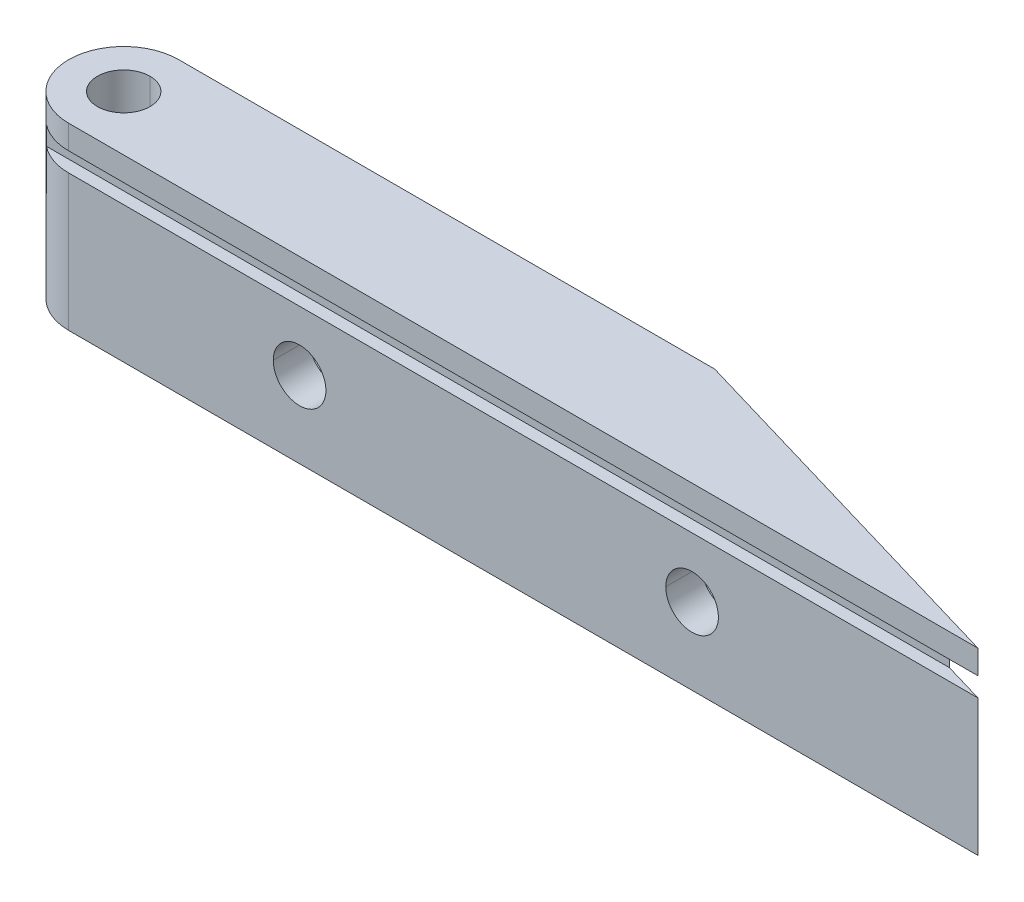
ISO-10303-21;
HEADER;
FILE_DESCRIPTION(('STEP AP214'),'2;1');
FILE_NAME('part.step','',(''),(''),'','','');
FILE_SCHEMA(('AUTOMOTIVE_DESIGN { 1 0 10303 214 1 1 1 1 }'));
ENDSEC;
DATA;
#1=APPLICATION_CONTEXT('core data for automotive mechanical design processes');
#2=APPLICATION_PROTOCOL_DEFINITION('international standard','automotive_design',2000,#1);
#3=PRODUCT_CONTEXT('',#1,'mechanical');
#4=PRODUCT('Part','Part','',(#3));
#5=PRODUCT_RELATED_PRODUCT_CATEGORY('part','',(#4));
#6=PRODUCT_DEFINITION_FORMATION('','',#4);
#7=PRODUCT_DEFINITION_CONTEXT('part definition',#1,'design');
#8=PRODUCT_DEFINITION('design','',#6,#7);
#9=PRODUCT_DEFINITION_SHAPE('','',#8);
#10=(LENGTH_UNIT() NAMED_UNIT(*) SI_UNIT(.MILLI.,.METRE.));
#11=(NAMED_UNIT(*) PLANE_ANGLE_UNIT() SI_UNIT($,.RADIAN.));
#12=(NAMED_UNIT(*) SI_UNIT($,.STERADIAN.) SOLID_ANGLE_UNIT());
#13=UNCERTAINTY_MEASURE_WITH_UNIT(LENGTH_MEASURE(1.E-05),#10,'distance_accuracy_value','');
#14=(GEOMETRIC_REPRESENTATION_CONTEXT(3) GLOBAL_UNCERTAINTY_ASSIGNED_CONTEXT((#13)) GLOBAL_UNIT_ASSIGNED_CONTEXT((#10,
#11,#12)) REPRESENTATION_CONTEXT('',''));
#15=CARTESIAN_POINT('',(0.,0.,0.));
#16=DIRECTION('',(0.,0.,1.));
#17=DIRECTION('',(1.,0.,0.));
#18=AXIS2_PLACEMENT_3D('',#15,#16,#17);
#19=CARTESIAN_POINT('',(-6.23,3.2,-2.8));
#20=DIRECTION('',(0.,0.,1.));
#21=DIRECTION('',(1.,0.,0.));
#22=AXIS2_PLACEMENT_3D('',#19,#20,#21);
#23=CYLINDRICAL_SURFACE('',#22,1.1);
#24=DIRECTION('',(0.,0.,1.));
#25=VECTOR('',#24,1.);
#26=CARTESIAN_POINT('',(-7.33,3.2,-2.8));
#27=LINE('',#26,#25);
#28=CARTESIAN_POINT('',(-7.33,3.2,0.3));
#29=VERTEX_POINT('',#28);
#30=CARTESIAN_POINT('',(-7.33,3.2,1.8));
#31=VERTEX_POINT('',#30);
#32=EDGE_CURVE('E220',#29,#31,#27,.T.);
#33=ORIENTED_EDGE('',*,*,#32,.F.);
#34=CARTESIAN_POINT('',(-6.23,3.2,0.3));
#35=DIRECTION('',(0.,0.,-1.));
#36=DIRECTION('',(-1.,0.,0.));
#37=AXIS2_PLACEMENT_3D('',#34,#35,#36);
#38=CIRCLE('',#37,1.1);
#39=CARTESIAN_POINT('',(-5.12999999999994,3.2,0.3));
#40=VERTEX_POINT('',#39);
#41=EDGE_CURVE('E215',#29,#40,#38,.T.);
#42=ORIENTED_EDGE('',*,*,#41,.T.);
#43=DIRECTION('',(0.,0.,1.));
#44=VECTOR('',#43,1.);
#45=CARTESIAN_POINT('',(-5.12999999999994,3.2,-2.8));
#46=LINE('',#45,#44);
#47=CARTESIAN_POINT('',(-5.12999999999994,3.2,1.8));
#48=VERTEX_POINT('',#47);
#49=EDGE_CURVE('E217',#40,#48,#46,.T.);
#50=ORIENTED_EDGE('',*,*,#49,.T.);
#51=CARTESIAN_POINT('',(-6.23,3.2,1.8));
#52=DIRECTION('',(0.,0.,1.));
#53=DIRECTION('',(1.,0.,0.));
#54=AXIS2_PLACEMENT_3D('',#51,#52,#53);
#55=CIRCLE('',#54,1.1);
#56=EDGE_CURVE('E345',#48,#31,#55,.T.);
#57=ORIENTED_EDGE('',*,*,#56,.T.);
#58=EDGE_LOOP('',(#33,#42,#50,#57));
#59=FACE_BOUND('',#58,.T.);
#60=ADVANCED_FACE('F15',(#59),#23,.F.);
#61=CARTESIAN_POINT('',(10.1714,3.2,-2.8));
#62=DIRECTION('',(0.,0.,1.));
#63=DIRECTION('',(1.,0.,0.));
#64=AXIS2_PLACEMENT_3D('',#61,#62,#63);
#65=CYLINDRICAL_SURFACE('',#64,1.1);
#66=DIRECTION('',(0.,0.,1.));
#67=VECTOR('',#66,1.);
#68=CARTESIAN_POINT('',(9.0714,3.2,-2.8));
#69=LINE('',#68,#67);
#70=CARTESIAN_POINT('',(9.0714,3.2,0.3));
#71=VERTEX_POINT('',#70);
#72=CARTESIAN_POINT('',(9.0714,3.2,1.8));
#73=VERTEX_POINT('',#72);
#74=EDGE_CURVE('E284',#71,#73,#69,.T.);
#75=ORIENTED_EDGE('',*,*,#74,.F.);
#76=CARTESIAN_POINT('',(10.1714,3.2,0.3));
#77=DIRECTION('',(0.,0.,-1.));
#78=DIRECTION('',(-1.,0.,0.));
#79=AXIS2_PLACEMENT_3D('',#76,#77,#78);
#80=CIRCLE('',#79,1.1);
#81=CARTESIAN_POINT('',(11.2714,3.2,0.3));
#82=VERTEX_POINT('',#81);
#83=EDGE_CURVE('E225',#71,#82,#80,.T.);
#84=ORIENTED_EDGE('',*,*,#83,.T.);
#85=DIRECTION('',(0.,0.,1.));
#86=VECTOR('',#85,1.);
#87=CARTESIAN_POINT('',(11.2714,3.2,-2.8));
#88=LINE('',#87,#86);
#89=CARTESIAN_POINT('',(11.2714,3.2,1.8));
#90=VERTEX_POINT('',#89);
#91=EDGE_CURVE('E252',#82,#90,#88,.T.);
#92=ORIENTED_EDGE('',*,*,#91,.T.);
#93=CARTESIAN_POINT('',(10.1714,3.2,1.8));
#94=DIRECTION('',(0.,0.,1.));
#95=DIRECTION('',(1.,0.,0.));
#96=AXIS2_PLACEMENT_3D('',#93,#94,#95);
#97=CIRCLE('',#96,1.1);
#98=EDGE_CURVE('E348',#90,#73,#97,.T.);
#99=ORIENTED_EDGE('',*,*,#98,.T.);
#100=EDGE_LOOP('',(#75,#84,#92,#99));
#101=FACE_BOUND('',#100,.T.);
#102=ADVANCED_FACE('F466',(#101),#65,.F.);
#103=CARTESIAN_POINT('',(66.8280112353159,5.7,1.301));
#104=DIRECTION('',(0.,-1.,0.));
#105=DIRECTION('',(0.,0.,-1.));
#106=AXIS2_PLACEMENT_3D('',#103,#104,#105);
#107=PLANE('',#106);
#108=DIRECTION('',(1.,0.,0.));
#109=VECTOR('',#108,1.);
#110=CARTESIAN_POINT('',(66.8280112353159,5.7,1.301));
#111=LINE('',#110,#109);
#112=CARTESIAN_POINT('',(-17.3105240298575,5.7,1.301));
#113=VERTEX_POINT('',#112);
#114=CARTESIAN_POINT('',(20.4277391304349,5.7,1.301));
#115=VERTEX_POINT('',#114);
#116=EDGE_CURVE('E10',#113,#115,#111,.T.);
#117=ORIENTED_EDGE('',*,*,#116,.F.);
#118=CARTESIAN_POINT('',(-15.88,5.7,-0.5));
#119=DIRECTION('',(0.,-1.,0.));
#120=DIRECTION('',(1.,0.,0.));
#121=AXIS2_PLACEMENT_3D('',#118,#119,#120);
#122=CIRCLE('',#121,2.3);
#123=CARTESIAN_POINT('',(-15.88,5.7,1.8));
#124=VERTEX_POINT('',#123);
#125=EDGE_CURVE('E455',#124,#113,#122,.T.);
#126=ORIENTED_EDGE('',*,*,#125,.F.);
#127=DIRECTION('',(-1.,0.,0.));
#128=VECTOR('',#127,1.);
#129=CARTESIAN_POINT('',(22.12,5.7,1.8));
#130=LINE('',#129,#128);
#131=CARTESIAN_POINT('',(22.12,5.7,1.8));
#132=VERTEX_POINT('',#131);
#133=EDGE_CURVE('E36',#132,#124,#130,.T.);
#134=ORIENTED_EDGE('',*,*,#133,.F.);
#135=DIRECTION('',(0.959169457756016,0.,0.282832019594723));
#136=VECTOR('',#135,1.);
#137=CARTESIAN_POINT('',(6.52000000000011,5.7,-2.8));
#138=LINE('',#137,#136);
#139=EDGE_CURVE('E408',#115,#132,#138,.T.);
#140=ORIENTED_EDGE('',*,*,#139,.F.);
#141=EDGE_LOOP('',(#117,#126,#134,#140));
#142=FACE_BOUND('',#141,.T.);
#143=ADVANCED_FACE('F491',(#142),#107,.F.);
#144=CARTESIAN_POINT('',(66.8280112353159,6.5,1.301));
#145=DIRECTION('',(0.,1.,0.));
#146=DIRECTION('',(1.,0.,0.));
#147=AXIS2_PLACEMENT_3D('',#144,#145,#146);
#148=PLANE('',#147);
#149=DIRECTION('',(1.,0.,0.));
#150=VECTOR('',#149,1.);
#151=CARTESIAN_POINT('',(22.12,6.5,1.8));
#152=LINE('',#151,#150);
#153=CARTESIAN_POINT('',(-15.88,6.5,1.8));
#154=VERTEX_POINT('',#153);
#155=CARTESIAN_POINT('',(22.12,6.5,1.8));
#156=VERTEX_POINT('',#155);
#157=EDGE_CURVE('E336',#154,#156,#152,.T.);
#158=ORIENTED_EDGE('',*,*,#157,.F.);
#159=CARTESIAN_POINT('',(-15.88,6.5,-0.5));
#160=DIRECTION('',(0.,1.,0.));
#161=DIRECTION('',(-1.,0.,0.));
#162=AXIS2_PLACEMENT_3D('',#159,#160,#161);
#163=CIRCLE('',#162,2.3);
#164=CARTESIAN_POINT('',(-17.3105240298575,6.5,1.301));
#165=VERTEX_POINT('',#164);
#166=EDGE_CURVE('E290',#165,#154,#163,.T.);
#167=ORIENTED_EDGE('',*,*,#166,.F.);
#168=DIRECTION('',(-1.,0.,0.));
#169=VECTOR('',#168,1.);
#170=CARTESIAN_POINT('',(66.8280112353159,6.5,1.301));
#171=LINE('',#170,#169);
#172=CARTESIAN_POINT('',(20.4277391304349,6.5,1.301));
#173=VERTEX_POINT('',#172);
#174=EDGE_CURVE('E23',#173,#165,#171,.T.);
#175=ORIENTED_EDGE('',*,*,#174,.F.);
#176=DIRECTION('',(-0.959169457756016,0.,-0.282832019594723));
#177=VECTOR('',#176,1.);
#178=CARTESIAN_POINT('',(6.52000000000011,6.5,-2.8));
#179=LINE('',#178,#177);
#180=EDGE_CURVE('E298',#156,#173,#179,.T.);
#181=ORIENTED_EDGE('',*,*,#180,.F.);
#182=EDGE_LOOP('',(#158,#167,#175,#181));
#183=FACE_BOUND('',#182,.T.);
#184=ADVANCED_FACE('F495',(#183),#148,.F.);
#185=CARTESIAN_POINT('',(0.,0.,1.301));
#186=DIRECTION('',(0.,0.,1.));
#187=DIRECTION('',(1.,0.,0.));
#188=AXIS2_PLACEMENT_3D('',#185,#186,#187);
#189=PLANE('',#188);
#190=DIRECTION('',(0.,1.,0.));
#191=VECTOR('',#190,1.);
#192=CARTESIAN_POINT('',(20.4277391304349,7.5,1.301));
#193=LINE('',#192,#191);
#194=EDGE_CURVE('E302',#115,#173,#193,.T.);
#195=ORIENTED_EDGE('',*,*,#194,.T.);
#196=ORIENTED_EDGE('',*,*,#174,.T.);
#197=DIRECTION('',(0.,-1.,0.));
#198=VECTOR('',#197,1.);
#199=CARTESIAN_POINT('',(-17.3105240298575,7.5,1.301));
#200=LINE('',#199,#198);
#201=EDGE_CURVE('E294',#165,#113,#200,.T.);
#202=ORIENTED_EDGE('',*,*,#201,.T.);
#203=ORIENTED_EDGE('',*,*,#116,.T.);
#204=EDGE_LOOP('',(#195,#196,#202,#203));
#205=FACE_BOUND('',#204,.T.);
#206=ADVANCED_FACE('F484',(#205),#189,.T.);
#207=CARTESIAN_POINT('',(-15.88,0.5,0.3));
#208=DIRECTION('',(1.,0.,0.));
#209=DIRECTION('',(0.,1.,0.));
#210=AXIS2_PLACEMENT_3D('',#207,#208,#209);
#211=PLANE('',#210);
#212=DIRECTION('',(0.,0.,1.));
#213=VECTOR('',#212,1.);
#214=CARTESIAN_POINT('',(-15.88,7.,0.3));
#215=LINE('',#214,#213);
#216=CARTESIAN_POINT('',(-15.88,7.,1.1));
#217=VERTEX_POINT('',#216);
#218=CARTESIAN_POINT('',(-15.88,7.,1.3));
#219=VERTEX_POINT('',#218);
#220=EDGE_CURVE('E311',#217,#219,#215,.T.);
#221=ORIENTED_EDGE('',*,*,#220,.F.);
#222=DIRECTION('',(0.,-1.,0.));
#223=VECTOR('',#222,1.);
#224=CARTESIAN_POINT('',(-15.88,7.5,1.1));
#225=LINE('',#224,#223);
#226=CARTESIAN_POINT('',(-15.88,0.5,1.1));
#227=VERTEX_POINT('',#226);
#228=EDGE_CURVE('E285',#217,#227,#225,.T.);
#229=ORIENTED_EDGE('',*,*,#228,.T.);
#230=DIRECTION('',(0.,0.,1.));
#231=VECTOR('',#230,1.);
#232=CARTESIAN_POINT('',(-15.88,0.5,0.3));
#233=LINE('',#232,#231);
#234=CARTESIAN_POINT('',(-15.88,0.5,1.3));
#235=VERTEX_POINT('',#234);
#236=EDGE_CURVE('E386',#227,#235,#233,.T.);
#237=ORIENTED_EDGE('',*,*,#236,.T.);
#238=DIRECTION('',(0.,-1.,0.));
#239=VECTOR('',#238,1.);
#240=CARTESIAN_POINT('',(-15.88,7.5,1.3));
#241=LINE('',#240,#239);
#242=EDGE_CURVE('E226',#219,#235,#241,.T.);
#243=ORIENTED_EDGE('',*,*,#242,.F.);
#244=EDGE_LOOP('',(#221,#229,#237,#243));
#245=FACE_BOUND('',#244,.T.);
#246=ADVANCED_FACE('F474',(#245),#211,.F.);
#247=CARTESIAN_POINT('',(0.,0.,0.3));
#248=DIRECTION('',(0.,0.,-1.));
#249=DIRECTION('',(0.,-1.,0.));
#250=AXIS2_PLACEMENT_3D('',#247,#248,#249);
#251=PLANE('',#250);
#252=CARTESIAN_POINT('',(10.1714,3.2,0.3));
#253=DIRECTION('',(0.,0.,-1.));
#254=DIRECTION('',(-1.,0.,0.));
#255=AXIS2_PLACEMENT_3D('',#252,#253,#254);
#256=CIRCLE('',#255,1.1);
#257=EDGE_CURVE('E234',#82,#71,#256,.T.);
#258=ORIENTED_EDGE('',*,*,#257,.F.);
#259=ORIENTED_EDGE('',*,*,#83,.F.);
#260=EDGE_LOOP('',(#258,#259));
#261=FACE_BOUND('',#260,.T.);
#262=CARTESIAN_POINT('',(-6.23,3.2,0.3));
#263=DIRECTION('',(0.,0.,-1.));
#264=DIRECTION('',(-1.,0.,0.));
#265=AXIS2_PLACEMENT_3D('',#262,#263,#264);
#266=CIRCLE('',#265,1.1);
#267=EDGE_CURVE('E230',#40,#29,#266,.T.);
#268=ORIENTED_EDGE('',*,*,#267,.F.);
#269=ORIENTED_EDGE('',*,*,#41,.F.);
#270=EDGE_LOOP('',(#268,#269));
#271=FACE_BOUND('',#270,.T.);
#272=DIRECTION('',(0.,1.,0.));
#273=VECTOR('',#272,1.);
#274=CARTESIAN_POINT('',(17.033043478261,0.,0.3));
#275=LINE('',#274,#273);
#276=CARTESIAN_POINT('',(17.033043478261,0.5,0.3));
#277=VERTEX_POINT('',#276);
#278=CARTESIAN_POINT('',(17.033043478261,7.,0.3));
#279=VERTEX_POINT('',#278);
#280=EDGE_CURVE('E362',#277,#279,#275,.T.);
#281=ORIENTED_EDGE('',*,*,#280,.F.);
#282=DIRECTION('',(-1.,0.,0.));
#283=VECTOR('',#282,1.);
#284=CARTESIAN_POINT('',(20.4243478260871,0.5,0.3));
#285=LINE('',#284,#283);
#286=CARTESIAN_POINT('',(-14.4943593539448,0.5,0.3));
#287=VERTEX_POINT('',#286);
#288=EDGE_CURVE('E393',#277,#287,#285,.T.);
#289=ORIENTED_EDGE('',*,*,#288,.T.);
#290=DIRECTION('',(0.,-1.,0.));
#291=VECTOR('',#290,1.);
#292=CARTESIAN_POINT('',(-14.4943593539448,7.5,0.3));
#293=LINE('',#292,#291);
#294=CARTESIAN_POINT('',(-14.4943593539448,7.,0.3));
#295=VERTEX_POINT('',#294);
#296=EDGE_CURVE('E303',#295,#287,#293,.T.);
#297=ORIENTED_EDGE('',*,*,#296,.F.);
#298=DIRECTION('',(1.,0.,0.));
#299=VECTOR('',#298,1.);
#300=CARTESIAN_POINT('',(-15.88,7.,0.3));
#301=LINE('',#300,#299);
#302=EDGE_CURVE('E375',#295,#279,#301,.T.);
#303=ORIENTED_EDGE('',*,*,#302,.T.);
#304=EDGE_LOOP('',(#281,#289,#297,#303));
#305=FACE_BOUND('',#304,.T.);
#306=ADVANCED_FACE('F236',(#261,#271,#305),#251,.T.);
#307=CARTESIAN_POINT('',(-15.88,7.5,-0.5));
#308=DIRECTION('',(0.,-1.,0.));
#309=DIRECTION('',(0.,0.,-1.));
#310=AXIS2_PLACEMENT_3D('',#307,#308,#309);
#311=CYLINDRICAL_SURFACE('',#310,1.8);
#312=CARTESIAN_POINT('',(-15.88,0.5,-0.5));
#313=DIRECTION('',(0.,1.,0.));
#314=DIRECTION('',(0.,0.,1.));
#315=AXIS2_PLACEMENT_3D('',#312,#313,#314);
#316=CIRCLE('',#315,1.8);
#317=CARTESIAN_POINT('',(-15.88,0.5,-2.3));
#318=VERTEX_POINT('',#317);
#319=EDGE_CURVE('E382',#318,#235,#316,.T.);
#320=ORIENTED_EDGE('',*,*,#319,.F.);
#321=DIRECTION('',(0.,-1.,0.));
#322=VECTOR('',#321,1.);
#323=CARTESIAN_POINT('',(-15.88,3.75,-2.3));
#324=LINE('',#323,#322);
#325=CARTESIAN_POINT('',(-15.88,7.,-2.3));
#326=VERTEX_POINT('',#325);
#327=EDGE_CURVE('E262',#326,#318,#324,.T.);
#328=ORIENTED_EDGE('',*,*,#327,.F.);
#329=CARTESIAN_POINT('',(-15.88,7.,-0.5));
#330=DIRECTION('',(0.,1.,0.));
#331=DIRECTION('',(0.,0.,1.));
#332=AXIS2_PLACEMENT_3D('',#329,#330,#331);
#333=CIRCLE('',#332,1.8);
#334=EDGE_CURVE('E280',#326,#219,#333,.T.);
#335=ORIENTED_EDGE('',*,*,#334,.T.);
#336=ORIENTED_EDGE('',*,*,#242,.T.);
#337=EDGE_LOOP('',(#320,#328,#335,#336));
#338=FACE_BOUND('',#337,.T.);
#339=ADVANCED_FACE('F473',(#338),#311,.F.);
#340=CARTESIAN_POINT('',(-15.88,7.5,-2.8));
#341=DIRECTION('',(-1.,0.,0.));
#342=DIRECTION('',(0.,0.,1.));
#343=AXIS2_PLACEMENT_3D('',#340,#341,#342);
#344=PLANE('',#343);
#345=DIRECTION('',(0.,-1.,0.));
#346=VECTOR('',#345,1.);
#347=CARTESIAN_POINT('',(-15.88,7.5,-2.8));
#348=LINE('',#347,#346);
#349=CARTESIAN_POINT('',(-15.88,7.,-2.8));
#350=VERTEX_POINT('',#349);
#351=CARTESIAN_POINT('',(-15.88,0.5,-2.8));
#352=VERTEX_POINT('',#351);
#353=EDGE_CURVE('E449',#350,#352,#348,.T.);
#354=ORIENTED_EDGE('',*,*,#353,.F.);
#355=DIRECTION('',(0.,0.,-1.));
#356=VECTOR('',#355,1.);
#357=CARTESIAN_POINT('',(-15.88,7.,-2.8));
#358=LINE('',#357,#356);
#359=EDGE_CURVE('E275',#326,#350,#358,.T.);
#360=ORIENTED_EDGE('',*,*,#359,.F.);
#361=ORIENTED_EDGE('',*,*,#327,.T.);
#362=DIRECTION('',(0.,0.,-1.));
#363=VECTOR('',#362,1.);
#364=CARTESIAN_POINT('',(-15.88,0.5,-2.8));
#365=LINE('',#364,#363);
#366=EDGE_CURVE('E273',#318,#352,#365,.T.);
#367=ORIENTED_EDGE('',*,*,#366,.T.);
#368=EDGE_LOOP('',(#354,#360,#361,#367));
#369=FACE_BOUND('',#368,.T.);
#370=ADVANCED_FACE('F481',(#369),#344,.F.);
#371=CARTESIAN_POINT('',(-15.88,7.5,-2.8));
#372=DIRECTION('',(0.,0.,1.));
#373=DIRECTION('',(1.,0.,0.));
#374=AXIS2_PLACEMENT_3D('',#371,#372,#373);
#375=PLANE('',#374);
#376=DIRECTION('',(0.,-1.,0.));
#377=VECTOR('',#376,1.);
#378=CARTESIAN_POINT('',(6.52000000000011,7.5,-2.8));
#379=LINE('',#378,#377);
#380=CARTESIAN_POINT('',(6.52000000000011,7.5,-2.8));
#381=VERTEX_POINT('',#380);
#382=CARTESIAN_POINT('',(6.52000000000011,7.,-2.8));
#383=VERTEX_POINT('',#382);
#384=EDGE_CURVE('E423',#381,#383,#379,.T.);
#385=ORIENTED_EDGE('',*,*,#384,.T.);
#386=DIRECTION('',(-1.,0.,0.));
#387=VECTOR('',#386,1.);
#388=CARTESIAN_POINT('',(-15.88,7.,-2.8));
#389=LINE('',#388,#387);
#390=EDGE_CURVE('E279',#383,#350,#389,.T.);
#391=ORIENTED_EDGE('',*,*,#390,.T.);
#392=DIRECTION('',(0.,-1.,0.));
#393=VECTOR('',#392,1.);
#394=CARTESIAN_POINT('',(-15.88,7.5,-2.8));
#395=LINE('',#394,#393);
#396=CARTESIAN_POINT('',(-15.88,7.5,-2.8));
#397=VERTEX_POINT('',#396);
#398=EDGE_CURVE('E293',#397,#350,#395,.T.);
#399=ORIENTED_EDGE('',*,*,#398,.F.);
#400=DIRECTION('',(-1.,0.,0.));
#401=VECTOR('',#400,1.);
#402=CARTESIAN_POINT('',(-15.88,7.5,-2.8));
#403=LINE('',#402,#401);
#404=EDGE_CURVE('E247',#381,#397,#403,.T.);
#405=ORIENTED_EDGE('',*,*,#404,.F.);
#406=EDGE_LOOP('',(#385,#391,#399,#405));
#407=FACE_BOUND('',#406,.T.);
#408=ADVANCED_FACE('F539',(#407),#375,.F.);
#409=CARTESIAN_POINT('',(22.12,7.5,1.8));
#410=DIRECTION('',(0.,0.,-1.));
#411=DIRECTION('',(-1.,0.,0.));
#412=AXIS2_PLACEMENT_3D('',#409,#410,#411);
#413=PLANE('',#412);
#414=ORIENTED_EDGE('',*,*,#98,.F.);
#415=CARTESIAN_POINT('',(10.1714,3.2,1.8));
#416=DIRECTION('',(0.,0.,1.));
#417=DIRECTION('',(1.,0.,0.));
#418=AXIS2_PLACEMENT_3D('',#415,#416,#417);
#419=CIRCLE('',#418,1.1);
#420=EDGE_CURVE('E257',#73,#90,#419,.T.);
#421=ORIENTED_EDGE('',*,*,#420,.F.);
#422=EDGE_LOOP('',(#414,#421));
#423=FACE_BOUND('',#422,.T.);
#424=ORIENTED_EDGE('',*,*,#56,.F.);
#425=CARTESIAN_POINT('',(-6.23,3.2,1.8));
#426=DIRECTION('',(0.,0.,1.));
#427=DIRECTION('',(1.,0.,0.));
#428=AXIS2_PLACEMENT_3D('',#425,#426,#427);
#429=CIRCLE('',#428,1.1);
#430=EDGE_CURVE('E232',#31,#48,#429,.T.);
#431=ORIENTED_EDGE('',*,*,#430,.F.);
#432=EDGE_LOOP('',(#424,#431));
#433=FACE_BOUND('',#432,.T.);
#434=DIRECTION('',(0.,-1.,0.));
#435=VECTOR('',#434,1.);
#436=CARTESIAN_POINT('',(22.12,7.5,1.8));
#437=LINE('',#436,#435);
#438=CARTESIAN_POINT('',(22.12,0.,1.8));
#439=VERTEX_POINT('',#438);
#440=EDGE_CURVE('E414',#132,#439,#437,.T.);
#441=ORIENTED_EDGE('',*,*,#440,.F.);
#442=ORIENTED_EDGE('',*,*,#133,.T.);
#443=DIRECTION('',(0.,-1.,0.));
#444=VECTOR('',#443,1.);
#445=CARTESIAN_POINT('',(-15.88,7.5,1.8));
#446=LINE('',#445,#444);
#447=CARTESIAN_POINT('',(-15.88,0.,1.8));
#448=VERTEX_POINT('',#447);
#449=EDGE_CURVE('E452',#124,#448,#446,.T.);
#450=ORIENTED_EDGE('',*,*,#449,.T.);
#451=DIRECTION('',(1.,0.,0.));
#452=VECTOR('',#451,1.);
#453=CARTESIAN_POINT('',(22.12,0.,1.8));
#454=LINE('',#453,#452);
#455=EDGE_CURVE('E440',#448,#439,#454,.T.);
#456=ORIENTED_EDGE('',*,*,#455,.T.);
#457=EDGE_LOOP('',(#441,#442,#450,#456));
#458=FACE_BOUND('',#457,.T.);
#459=ADVANCED_FACE('F536',(#423,#433,#458),#413,.F.);
#460=CARTESIAN_POINT('',(-15.88,7.5,-0.5));
#461=DIRECTION('',(0.,-1.,0.));
#462=DIRECTION('',(0.,0.,-1.));
#463=AXIS2_PLACEMENT_3D('',#460,#461,#462);
#464=CYLINDRICAL_SURFACE('',#463,2.3);
#465=ORIENTED_EDGE('',*,*,#201,.F.);
#466=ORIENTED_EDGE('',*,*,#166,.T.);
#467=DIRECTION('',(0.,-1.,0.));
#468=VECTOR('',#467,1.);
#469=CARTESIAN_POINT('',(-15.88,7.5,1.8));
#470=LINE('',#469,#468);
#471=CARTESIAN_POINT('',(-15.88,7.5,1.8));
#472=VERTEX_POINT('',#471);
#473=EDGE_CURVE('E326',#472,#154,#470,.T.);
#474=ORIENTED_EDGE('',*,*,#473,.F.);
#475=CARTESIAN_POINT('',(-15.88,7.5,-0.5));
#476=DIRECTION('',(0.,1.,0.));
#477=DIRECTION('',(0.,0.,1.));
#478=AXIS2_PLACEMENT_3D('',#475,#476,#477);
#479=CIRCLE('',#478,2.3);
#480=EDGE_CURVE('E250',#397,#472,#479,.T.);
#481=ORIENTED_EDGE('',*,*,#480,.F.);
#482=ORIENTED_EDGE('',*,*,#398,.T.);
#483=ORIENTED_EDGE('',*,*,#353,.T.);
#484=DIRECTION('',(0.,-1.,0.));
#485=VECTOR('',#484,1.);
#486=CARTESIAN_POINT('',(-15.88,7.5,-2.8));
#487=LINE('',#486,#485);
#488=CARTESIAN_POINT('',(-15.88,0.,-2.8));
#489=VERTEX_POINT('',#488);
#490=EDGE_CURVE('E434',#352,#489,#487,.T.);
#491=ORIENTED_EDGE('',*,*,#490,.T.);
#492=CARTESIAN_POINT('',(-15.88,0.,-0.5));
#493=DIRECTION('',(0.,1.,0.));
#494=DIRECTION('',(0.,0.,1.));
#495=AXIS2_PLACEMENT_3D('',#492,#493,#494);
#496=CIRCLE('',#495,2.3);
#497=EDGE_CURVE('E245',#489,#448,#496,.T.);
#498=ORIENTED_EDGE('',*,*,#497,.T.);
#499=ORIENTED_EDGE('',*,*,#449,.F.);
#500=ORIENTED_EDGE('',*,*,#125,.T.);
#501=EDGE_LOOP('',(#465,#466,#474,#481,#482,#483,#491,#498,#499,#500));
#502=FACE_BOUND('',#501,.T.);
#503=ADVANCED_FACE('F534',(#502),#464,.T.);
#504=CARTESIAN_POINT('',(-15.88,0.,-0.5));
#505=DIRECTION('',(0.,1.,0.));
#506=DIRECTION('',(1.,0.,0.));
#507=AXIS2_PLACEMENT_3D('',#504,#505,#506);
#508=PLANE('',#507);
#509=CARTESIAN_POINT('',(-15.88,0.,-0.5));
#510=DIRECTION('',(0.,1.,0.));
#511=DIRECTION('',(0.,0.,1.));
#512=AXIS2_PLACEMENT_3D('',#509,#510,#511);
#513=CIRCLE('',#512,1.1);
#514=CARTESIAN_POINT('',(-15.88,0.,-1.6));
#515=VERTEX_POINT('',#514);
#516=CARTESIAN_POINT('',(-15.88,0.,0.6));
#517=VERTEX_POINT('',#516);
#518=EDGE_CURVE('E267',#515,#517,#513,.T.);
#519=ORIENTED_EDGE('',*,*,#518,.T.);
#520=CARTESIAN_POINT('',(-15.88,0.,-0.5));
#521=DIRECTION('',(0.,1.,0.));
#522=DIRECTION('',(0.,0.,1.));
#523=AXIS2_PLACEMENT_3D('',#520,#521,#522);
#524=CIRCLE('',#523,1.1);
#525=EDGE_CURVE('E315',#517,#515,#524,.T.);
#526=ORIENTED_EDGE('',*,*,#525,.T.);
#527=EDGE_LOOP('',(#519,#526));
#528=FACE_BOUND('',#527,.T.);
#529=ORIENTED_EDGE('',*,*,#497,.F.);
#530=DIRECTION('',(-1.,0.,0.));
#531=VECTOR('',#530,1.);
#532=CARTESIAN_POINT('',(-15.88,0.,-2.8));
#533=LINE('',#532,#531);
#534=CARTESIAN_POINT('',(6.52000000000011,0.,-2.8));
#535=VERTEX_POINT('',#534);
#536=EDGE_CURVE('E429',#535,#489,#533,.T.);
#537=ORIENTED_EDGE('',*,*,#536,.F.);
#538=DIRECTION('',(-0.959169457756016,0.,-0.282832019594723));
#539=VECTOR('',#538,1.);
#540=CARTESIAN_POINT('',(6.52000000000011,0.,-2.8));
#541=LINE('',#540,#539);
#542=EDGE_CURVE('E363',#439,#535,#541,.T.);
#543=ORIENTED_EDGE('',*,*,#542,.F.);
#544=ORIENTED_EDGE('',*,*,#455,.F.);
#545=EDGE_LOOP('',(#529,#537,#543,#544));
#546=FACE_BOUND('',#545,.T.);
#547=ADVANCED_FACE('F516',(#528,#546),#508,.F.);
#548=CARTESIAN_POINT('',(-15.88,7.5,-0.5));
#549=DIRECTION('',(0.,1.,0.));
#550=DIRECTION('',(1.,0.,0.));
#551=AXIS2_PLACEMENT_3D('',#548,#549,#550);
#552=PLANE('',#551);
#553=CARTESIAN_POINT('',(-15.88,7.5,-0.5));
#554=DIRECTION('',(0.,1.,0.));
#555=DIRECTION('',(0.,0.,1.));
#556=AXIS2_PLACEMENT_3D('',#553,#554,#555);
#557=CIRCLE('',#556,1.1);
#558=CARTESIAN_POINT('',(-15.88,7.5,-1.6));
#559=VERTEX_POINT('',#558);
#560=CARTESIAN_POINT('',(-15.88,7.5,0.6));
#561=VERTEX_POINT('',#560);
#562=EDGE_CURVE('E268',#559,#561,#557,.T.);
#563=ORIENTED_EDGE('',*,*,#562,.F.);
#564=CARTESIAN_POINT('',(-15.88,7.5,-0.5));
#565=DIRECTION('',(0.,1.,0.));
#566=DIRECTION('',(0.,0.,1.));
#567=AXIS2_PLACEMENT_3D('',#564,#565,#566);
#568=CIRCLE('',#567,1.1);
#569=EDGE_CURVE('E355',#561,#559,#568,.T.);
#570=ORIENTED_EDGE('',*,*,#569,.F.);
#571=EDGE_LOOP('',(#563,#570));
#572=FACE_BOUND('',#571,.T.);
#573=ORIENTED_EDGE('',*,*,#480,.T.);
#574=DIRECTION('',(1.,0.,0.));
#575=VECTOR('',#574,1.);
#576=CARTESIAN_POINT('',(22.12,7.5,1.8));
#577=LINE('',#576,#575);
#578=CARTESIAN_POINT('',(22.12,7.5,1.8));
#579=VERTEX_POINT('',#578);
#580=EDGE_CURVE('E344',#472,#579,#577,.T.);
#581=ORIENTED_EDGE('',*,*,#580,.T.);
#582=DIRECTION('',(-0.959169457756016,0.,-0.282832019594723));
#583=VECTOR('',#582,1.);
#584=CARTESIAN_POINT('',(6.52000000000011,7.5,-2.8));
#585=LINE('',#584,#583);
#586=EDGE_CURVE('E426',#579,#381,#585,.T.);
#587=ORIENTED_EDGE('',*,*,#586,.T.);
#588=ORIENTED_EDGE('',*,*,#404,.T.);
#589=EDGE_LOOP('',(#573,#581,#587,#588));
#590=FACE_BOUND('',#589,.T.);
#591=ADVANCED_FACE('F512',(#572,#590),#552,.T.);
#592=CARTESIAN_POINT('',(-15.88,7.5,-2.8));
#593=DIRECTION('',(0.,0.,1.));
#594=DIRECTION('',(1.,0.,0.));
#595=AXIS2_PLACEMENT_3D('',#592,#593,#594);
#596=PLANE('',#595);
#597=DIRECTION('',(-1.,0.,0.));
#598=VECTOR('',#597,1.);
#599=CARTESIAN_POINT('',(-15.88,0.5,-2.8));
#600=LINE('',#599,#598);
#601=CARTESIAN_POINT('',(6.52000000000011,0.5,-2.8));
#602=VERTEX_POINT('',#601);
#603=EDGE_CURVE('E269',#602,#352,#600,.T.);
#604=ORIENTED_EDGE('',*,*,#603,.F.);
#605=DIRECTION('',(0.,-1.,0.));
#606=VECTOR('',#605,1.);
#607=CARTESIAN_POINT('',(6.52000000000011,7.5,-2.8));
#608=LINE('',#607,#606);
#609=EDGE_CURVE('E358',#602,#535,#608,.T.);
#610=ORIENTED_EDGE('',*,*,#609,.T.);
#611=ORIENTED_EDGE('',*,*,#536,.T.);
#612=ORIENTED_EDGE('',*,*,#490,.F.);
#613=EDGE_LOOP('',(#604,#610,#611,#612));
#614=FACE_BOUND('',#613,.T.);
#615=ADVANCED_FACE('F515',(#614),#596,.F.);
#616=CARTESIAN_POINT('',(6.52000000000011,7.5,-2.8));
#617=DIRECTION('',(-0.282832019594723,0.,0.959169457756016));
#618=DIRECTION('',(0.,1.,0.));
#619=AXIS2_PLACEMENT_3D('',#616,#617,#618);
#620=PLANE('',#619);
#621=DIRECTION('',(0.,-1.,0.));
#622=VECTOR('',#621,1.);
#623=CARTESIAN_POINT('',(22.12,7.5,1.8));
#624=LINE('',#623,#622);
#625=EDGE_CURVE('E340',#579,#156,#624,.T.);
#626=ORIENTED_EDGE('',*,*,#625,.T.);
#627=ORIENTED_EDGE('',*,*,#180,.T.);
#628=ORIENTED_EDGE('',*,*,#194,.F.);
#629=ORIENTED_EDGE('',*,*,#139,.T.);
#630=ORIENTED_EDGE('',*,*,#440,.T.);
#631=ORIENTED_EDGE('',*,*,#542,.T.);
#632=ORIENTED_EDGE('',*,*,#609,.F.);
#633=DIRECTION('',(-0.959169457756016,0.,-0.282832019594723));
#634=VECTOR('',#633,1.);
#635=CARTESIAN_POINT('',(6.52000000000011,0.5,-2.8));
#636=LINE('',#635,#634);
#637=EDGE_CURVE('E274',#277,#602,#636,.T.);
#638=ORIENTED_EDGE('',*,*,#637,.F.);
#639=ORIENTED_EDGE('',*,*,#280,.T.);
#640=DIRECTION('',(-0.959169457756016,0.,-0.282832019594723));
#641=VECTOR('',#640,1.);
#642=CARTESIAN_POINT('',(6.52000000000011,7.,-2.8));
#643=LINE('',#642,#641);
#644=EDGE_CURVE('E371',#279,#383,#643,.T.);
#645=ORIENTED_EDGE('',*,*,#644,.T.);
#646=ORIENTED_EDGE('',*,*,#384,.F.);
#647=ORIENTED_EDGE('',*,*,#586,.F.);
#648=EDGE_LOOP('',(#626,#627,#628,#629,#630,#631,#632,#638,#639,#645,#646,#647));
#649=FACE_BOUND('',#648,.T.);
#650=ADVANCED_FACE('F530',(#649),#620,.F.);
#651=CARTESIAN_POINT('',(-15.88,7.5,-0.5));
#652=DIRECTION('',(0.,-1.,0.));
#653=DIRECTION('',(0.,0.,-1.));
#654=AXIS2_PLACEMENT_3D('',#651,#652,#653);
#655=CYLINDRICAL_SURFACE('',#654,1.6);
#656=DIRECTION('',(0.,-1.,0.));
#657=VECTOR('',#656,1.);
#658=CARTESIAN_POINT('',(-15.88,7.5,-2.1));
#659=LINE('',#658,#657);
#660=CARTESIAN_POINT('',(-15.88,7.,-2.1));
#661=VERTEX_POINT('',#660);
#662=CARTESIAN_POINT('',(-15.88,0.5,-2.1));
#663=VERTEX_POINT('',#662);
#664=EDGE_CURVE('E310',#661,#663,#659,.T.);
#665=ORIENTED_EDGE('',*,*,#664,.F.);
#666=CARTESIAN_POINT('',(-15.88,7.,-0.5));
#667=DIRECTION('',(0.,1.,0.));
#668=DIRECTION('',(0.,0.,1.));
#669=AXIS2_PLACEMENT_3D('',#666,#667,#668);
#670=CIRCLE('',#669,1.6);
#671=EDGE_CURVE('E379',#295,#661,#670,.T.);
#672=ORIENTED_EDGE('',*,*,#671,.F.);
#673=ORIENTED_EDGE('',*,*,#296,.T.);
#674=CARTESIAN_POINT('',(-15.88,0.5,-0.5));
#675=DIRECTION('',(0.,1.,0.));
#676=DIRECTION('',(0.,0.,1.));
#677=AXIS2_PLACEMENT_3D('',#674,#675,#676);
#678=CIRCLE('',#677,1.6);
#679=EDGE_CURVE('E390',#287,#663,#678,.T.);
#680=ORIENTED_EDGE('',*,*,#679,.T.);
#681=EDGE_LOOP('',(#665,#672,#673,#680));
#682=FACE_BOUND('',#681,.T.);
#683=ADVANCED_FACE('F522',(#682),#655,.T.);
#684=CARTESIAN_POINT('',(-15.88,0.5,-0.5));
#685=DIRECTION('',(0.,1.,0.));
#686=DIRECTION('',(1.,0.,0.));
#687=AXIS2_PLACEMENT_3D('',#684,#685,#686);
#688=PLANE('',#687);
#689=ORIENTED_EDGE('',*,*,#319,.T.);
#690=ORIENTED_EDGE('',*,*,#236,.F.);
#691=CARTESIAN_POINT('',(-15.88,0.5,-0.5));
#692=DIRECTION('',(0.,1.,0.));
#693=DIRECTION('',(0.,0.,1.));
#694=AXIS2_PLACEMENT_3D('',#691,#692,#693);
#695=CIRCLE('',#694,1.6);
#696=EDGE_CURVE('E289',#663,#227,#695,.T.);
#697=ORIENTED_EDGE('',*,*,#696,.F.);
#698=ORIENTED_EDGE('',*,*,#679,.F.);
#699=ORIENTED_EDGE('',*,*,#288,.F.);
#700=ORIENTED_EDGE('',*,*,#637,.T.);
#701=ORIENTED_EDGE('',*,*,#603,.T.);
#702=ORIENTED_EDGE('',*,*,#366,.F.);
#703=EDGE_LOOP('',(#689,#690,#697,#698,#699,#700,#701,#702));
#704=FACE_BOUND('',#703,.T.);
#705=ADVANCED_FACE('F518',(#704),#688,.T.);
#706=CARTESIAN_POINT('',(-15.88,7.,-0.5));
#707=DIRECTION('',(0.,1.,0.));
#708=DIRECTION('',(1.,0.,0.));
#709=AXIS2_PLACEMENT_3D('',#706,#707,#708);
#710=PLANE('',#709);
#711=ORIENTED_EDGE('',*,*,#220,.T.);
#712=ORIENTED_EDGE('',*,*,#334,.F.);
#713=ORIENTED_EDGE('',*,*,#359,.T.);
#714=ORIENTED_EDGE('',*,*,#390,.F.);
#715=ORIENTED_EDGE('',*,*,#644,.F.);
#716=ORIENTED_EDGE('',*,*,#302,.F.);
#717=ORIENTED_EDGE('',*,*,#671,.T.);
#718=CARTESIAN_POINT('',(-15.88,7.,-0.5));
#719=DIRECTION('',(0.,1.,0.));
#720=DIRECTION('',(0.,0.,1.));
#721=AXIS2_PLACEMENT_3D('',#718,#719,#720);
#722=CIRCLE('',#721,1.6);
#723=EDGE_CURVE('E256',#661,#217,#722,.T.);
#724=ORIENTED_EDGE('',*,*,#723,.T.);
#725=EDGE_LOOP('',(#711,#712,#713,#714,#715,#716,#717,#724));
#726=FACE_BOUND('',#725,.T.);
#727=ADVANCED_FACE('F521',(#726),#710,.F.);
#728=CARTESIAN_POINT('',(-15.88,7.5,-0.5));
#729=DIRECTION('',(0.,-1.,0.));
#730=DIRECTION('',(0.,0.,-1.));
#731=AXIS2_PLACEMENT_3D('',#728,#729,#730);
#732=CYLINDRICAL_SURFACE('',#731,1.1);
#733=DIRECTION('',(0.,-1.,0.));
#734=VECTOR('',#733,1.);
#735=CARTESIAN_POINT('',(-15.88,7.5,0.6));
#736=LINE('',#735,#734);
#737=EDGE_CURVE('E263',#561,#517,#736,.T.);
#738=ORIENTED_EDGE('',*,*,#737,.F.);
#739=ORIENTED_EDGE('',*,*,#569,.T.);
#740=DIRECTION('',(0.,-1.,0.));
#741=VECTOR('',#740,1.);
#742=CARTESIAN_POINT('',(-15.88,7.5,-1.6));
#743=LINE('',#742,#741);
#744=EDGE_CURVE('E319',#559,#515,#743,.T.);
#745=ORIENTED_EDGE('',*,*,#744,.T.);
#746=ORIENTED_EDGE('',*,*,#525,.F.);
#747=EDGE_LOOP('',(#738,#739,#745,#746));
#748=FACE_BOUND('',#747,.T.);
#749=ADVANCED_FACE('F524',(#748),#732,.F.);
#750=CARTESIAN_POINT('',(22.12,7.5,1.8));
#751=DIRECTION('',(0.,0.,-1.));
#752=DIRECTION('',(-1.,0.,0.));
#753=AXIS2_PLACEMENT_3D('',#750,#751,#752);
#754=PLANE('',#753);
#755=ORIENTED_EDGE('',*,*,#473,.T.);
#756=ORIENTED_EDGE('',*,*,#157,.T.);
#757=ORIENTED_EDGE('',*,*,#625,.F.);
#758=ORIENTED_EDGE('',*,*,#580,.F.);
#759=EDGE_LOOP('',(#755,#756,#757,#758));
#760=FACE_BOUND('',#759,.T.);
#761=ADVANCED_FACE('F510',(#760),#754,.F.);
#762=CARTESIAN_POINT('',(-15.88,7.5,-0.5));
#763=DIRECTION('',(0.,-1.,0.));
#764=DIRECTION('',(0.,0.,-1.));
#765=AXIS2_PLACEMENT_3D('',#762,#763,#764);
#766=CYLINDRICAL_SURFACE('',#765,1.1);
#767=ORIENTED_EDGE('',*,*,#562,.T.);
#768=ORIENTED_EDGE('',*,*,#737,.T.);
#769=ORIENTED_EDGE('',*,*,#518,.F.);
#770=ORIENTED_EDGE('',*,*,#744,.F.);
#771=EDGE_LOOP('',(#767,#768,#769,#770));
#772=FACE_BOUND('',#771,.T.);
#773=ADVANCED_FACE('F997',(#772),#766,.F.);
#774=CARTESIAN_POINT('',(-15.88,7.5,-0.5));
#775=DIRECTION('',(0.,-1.,0.));
#776=DIRECTION('',(0.,0.,-1.));
#777=AXIS2_PLACEMENT_3D('',#774,#775,#776);
#778=CYLINDRICAL_SURFACE('',#777,1.6);
#779=ORIENTED_EDGE('',*,*,#723,.F.);
#780=ORIENTED_EDGE('',*,*,#664,.T.);
#781=ORIENTED_EDGE('',*,*,#696,.T.);
#782=ORIENTED_EDGE('',*,*,#228,.F.);
#783=EDGE_LOOP('',(#779,#780,#781,#782));
#784=FACE_BOUND('',#783,.T.);
#785=ADVANCED_FACE('F987',(#784),#778,.T.);
#786=CARTESIAN_POINT('',(10.1714,3.2,-2.8));
#787=DIRECTION('',(0.,0.,1.));
#788=DIRECTION('',(1.,0.,0.));
#789=AXIS2_PLACEMENT_3D('',#786,#787,#788);
#790=CYLINDRICAL_SURFACE('',#789,1.1);
#791=ORIENTED_EDGE('',*,*,#257,.T.);
#792=ORIENTED_EDGE('',*,*,#74,.T.);
#793=ORIENTED_EDGE('',*,*,#420,.T.);
#794=ORIENTED_EDGE('',*,*,#91,.F.);
#795=EDGE_LOOP('',(#791,#792,#793,#794));
#796=FACE_BOUND('',#795,.T.);
#797=ADVANCED_FACE('F470',(#796),#790,.F.);
#798=CARTESIAN_POINT('',(-6.23,3.2,-2.8));
#799=DIRECTION('',(0.,0.,1.));
#800=DIRECTION('',(1.,0.,0.));
#801=AXIS2_PLACEMENT_3D('',#798,#799,#800);
#802=CYLINDRICAL_SURFACE('',#801,1.1);
#803=ORIENTED_EDGE('',*,*,#267,.T.);
#804=ORIENTED_EDGE('',*,*,#32,.T.);
#805=ORIENTED_EDGE('',*,*,#430,.T.);
#806=ORIENTED_EDGE('',*,*,#49,.F.);
#807=EDGE_LOOP('',(#803,#804,#805,#806));
#808=FACE_BOUND('',#807,.T.);
#809=ADVANCED_FACE('F229',(#808),#802,.F.);
#810=CLOSED_SHELL('',(#60,#102,#143,#184,#206,#246,#306,#339,#370,#408,#459,#503,#547,#591,#615,
#650,#683,#705,#727,#749,#761,#773,#785,#797,#809));
#811=MANIFOLD_SOLID_BREP('B1',#810);
#812=ADVANCED_BREP_SHAPE_REPRESENTATION('',(#18,#811),#14);
#813=SHAPE_DEFINITION_REPRESENTATION(#9,#812);
ENDSEC;
END-ISO-10303-21;
